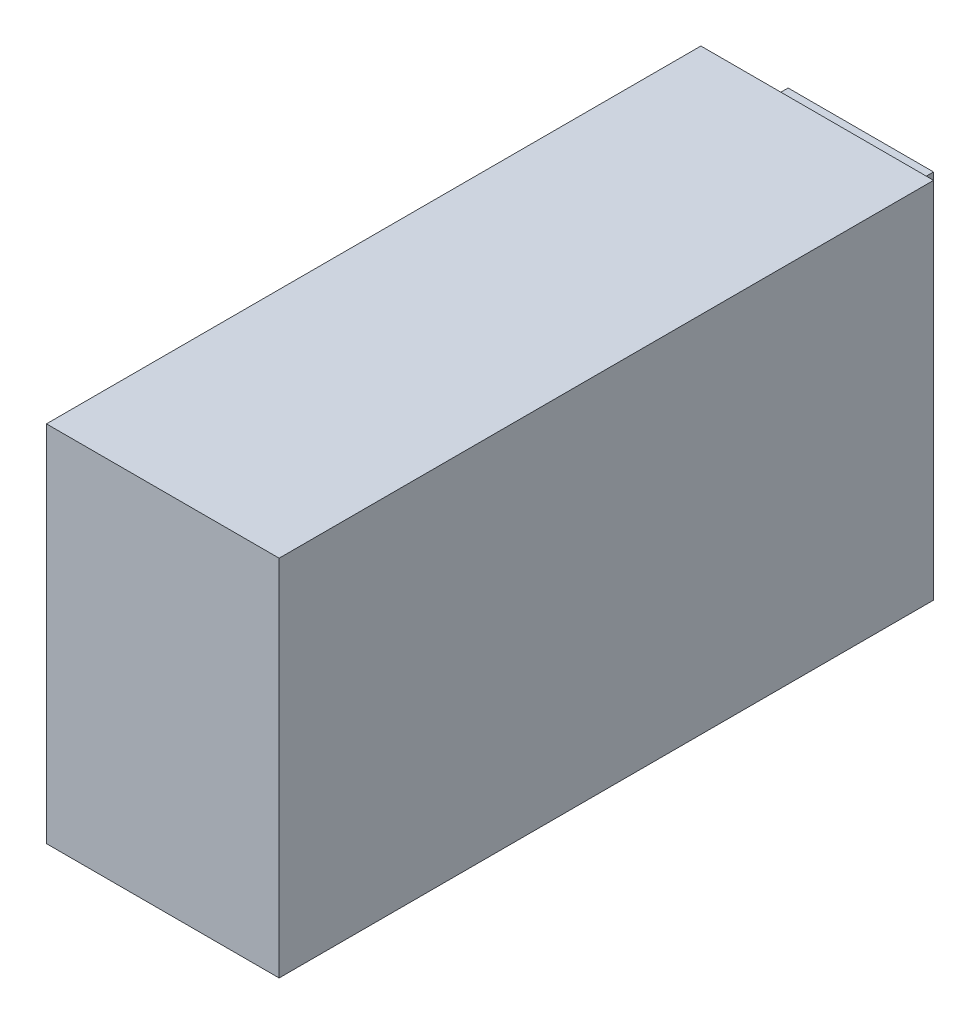
ISO-10303-21;
HEADER;
FILE_DESCRIPTION(('STEP AP214'),'2;1');
FILE_NAME('part.step','',(''),(''),'','','');
FILE_SCHEMA(('AUTOMOTIVE_DESIGN { 1 0 10303 214 1 1 1 1 }'));
ENDSEC;
DATA;
#1=APPLICATION_CONTEXT('core data for automotive mechanical design processes');
#2=APPLICATION_PROTOCOL_DEFINITION('international standard','automotive_design',2000,#1);
#3=PRODUCT_CONTEXT('',#1,'mechanical');
#4=PRODUCT('Part','Part','',(#3));
#5=PRODUCT_RELATED_PRODUCT_CATEGORY('part','',(#4));
#6=PRODUCT_DEFINITION_FORMATION('','',#4);
#7=PRODUCT_DEFINITION_CONTEXT('part definition',#1,'design');
#8=PRODUCT_DEFINITION('design','',#6,#7);
#9=PRODUCT_DEFINITION_SHAPE('','',#8);
#10=(LENGTH_UNIT() NAMED_UNIT(*) SI_UNIT(.MILLI.,.METRE.));
#11=(NAMED_UNIT(*) PLANE_ANGLE_UNIT() SI_UNIT($,.RADIAN.));
#12=(NAMED_UNIT(*) SI_UNIT($,.STERADIAN.) SOLID_ANGLE_UNIT());
#13=UNCERTAINTY_MEASURE_WITH_UNIT(LENGTH_MEASURE(1.E-05),#10,'distance_accuracy_value','');
#14=(GEOMETRIC_REPRESENTATION_CONTEXT(3) GLOBAL_UNCERTAINTY_ASSIGNED_CONTEXT((#13)) GLOBAL_UNIT_ASSIGNED_CONTEXT((#10,
#11,#12)) REPRESENTATION_CONTEXT('',''));
#15=CARTESIAN_POINT('',(0.,0.,0.));
#16=DIRECTION('',(0.,0.,1.));
#17=DIRECTION('',(1.,0.,0.));
#18=AXIS2_PLACEMENT_3D('',#15,#16,#17);
#19=CARTESIAN_POINT('',(0.,25.,-45.));
#20=DIRECTION('',(0.,0.,1.));
#21=DIRECTION('',(1.,0.,0.));
#22=AXIS2_PLACEMENT_3D('',#19,#20,#21);
#23=PLANE('',#22);
#24=DIRECTION('',(-1.,0.,0.));
#25=VECTOR('',#24,1.);
#26=CARTESIAN_POINT('',(0.,0.,-45.));
#27=LINE('',#26,#25);
#28=CARTESIAN_POINT('',(16.,0.,-45.));
#29=VERTEX_POINT('',#28);
#30=CARTESIAN_POINT('',(0.,0.,-45.));
#31=VERTEX_POINT('',#30);
#32=EDGE_CURVE('E131',#29,#31,#27,.T.);
#33=ORIENTED_EDGE('',*,*,#32,.T.);
#34=DIRECTION('',(0.,-1.,0.));
#35=VECTOR('',#34,1.);
#36=CARTESIAN_POINT('',(0.,25.,-45.));
#37=LINE('',#36,#35);
#38=CARTESIAN_POINT('',(0.,25.,-45.));
#39=VERTEX_POINT('',#38);
#40=EDGE_CURVE('E136',#39,#31,#37,.T.);
#41=ORIENTED_EDGE('',*,*,#40,.F.);
#42=DIRECTION('',(-1.,0.,0.));
#43=VECTOR('',#42,1.);
#44=CARTESIAN_POINT('',(0.,25.,-45.));
#45=LINE('',#44,#43);
#46=CARTESIAN_POINT('',(16.,25.,-45.));
#47=VERTEX_POINT('',#46);
#48=EDGE_CURVE('E135',#47,#39,#45,.T.);
#49=ORIENTED_EDGE('',*,*,#48,.F.);
#50=DIRECTION('',(0.,-1.,0.));
#51=VECTOR('',#50,1.);
#52=CARTESIAN_POINT('',(16.,25.,-45.));
#53=LINE('',#52,#51);
#54=EDGE_CURVE('E144',#47,#29,#53,.T.);
#55=ORIENTED_EDGE('',*,*,#54,.T.);
#56=EDGE_LOOP('',(#33,#41,#49,#55));
#57=FACE_BOUND('',#56,.T.);
#58=DIRECTION('',(0.,-1.,0.));
#59=VECTOR('',#58,1.);
#60=CARTESIAN_POINT('',(13.,22.5,-45.));
#61=LINE('',#60,#59);
#62=CARTESIAN_POINT('',(13.,22.5,-45.));
#63=VERTEX_POINT('',#62);
#64=CARTESIAN_POINT('',(13.,2.5,-45.));
#65=VERTEX_POINT('',#64);
#66=EDGE_CURVE('E48',#63,#65,#61,.T.);
#67=ORIENTED_EDGE('',*,*,#66,.F.);
#68=DIRECTION('',(1.,0.,0.));
#69=VECTOR('',#68,1.);
#70=CARTESIAN_POINT('',(13.,22.5,-45.));
#71=LINE('',#70,#69);
#72=CARTESIAN_POINT('',(3.,22.5,-45.));
#73=VERTEX_POINT('',#72);
#74=EDGE_CURVE('E52',#73,#63,#71,.T.);
#75=ORIENTED_EDGE('',*,*,#74,.F.);
#76=DIRECTION('',(0.,1.,0.));
#77=VECTOR('',#76,1.);
#78=CARTESIAN_POINT('',(3.,22.5,-45.));
#79=LINE('',#78,#77);
#80=CARTESIAN_POINT('',(3.,2.5,-45.));
#81=VERTEX_POINT('',#80);
#82=EDGE_CURVE('E260',#81,#73,#79,.T.);
#83=ORIENTED_EDGE('',*,*,#82,.F.);
#84=DIRECTION('',(-1.,0.,0.));
#85=VECTOR('',#84,1.);
#86=CARTESIAN_POINT('',(13.,2.5,-45.));
#87=LINE('',#86,#85);
#88=EDGE_CURVE('E266',#65,#81,#87,.T.);
#89=ORIENTED_EDGE('',*,*,#88,.F.);
#90=EDGE_LOOP('',(#67,#75,#83,#89));
#91=FACE_BOUND('',#90,.T.);
#92=ADVANCED_FACE('F33',(#57,#91),#23,.F.);
#93=CARTESIAN_POINT('',(0.,25.,0.));
#94=DIRECTION('',(1.,0.,0.));
#95=DIRECTION('',(0.,0.,-1.));
#96=AXIS2_PLACEMENT_3D('',#93,#94,#95);
#97=PLANE('',#96);
#98=DIRECTION('',(0.,0.,1.));
#99=VECTOR('',#98,1.);
#100=CARTESIAN_POINT('',(0.,0.,0.));
#101=LINE('',#100,#99);
#102=CARTESIAN_POINT('',(0.,0.,0.));
#103=VERTEX_POINT('',#102);
#104=EDGE_CURVE('E118',#31,#103,#101,.T.);
#105=ORIENTED_EDGE('',*,*,#104,.T.);
#106=DIRECTION('',(0.,-1.,0.));
#107=VECTOR('',#106,1.);
#108=CARTESIAN_POINT('',(0.,25.,0.));
#109=LINE('',#108,#107);
#110=CARTESIAN_POINT('',(0.,25.,0.));
#111=VERTEX_POINT('',#110);
#112=EDGE_CURVE('E11',#111,#103,#109,.T.);
#113=ORIENTED_EDGE('',*,*,#112,.F.);
#114=DIRECTION('',(0.,0.,1.));
#115=VECTOR('',#114,1.);
#116=CARTESIAN_POINT('',(0.,25.,0.));
#117=LINE('',#116,#115);
#118=EDGE_CURVE('E127',#39,#111,#117,.T.);
#119=ORIENTED_EDGE('',*,*,#118,.F.);
#120=ORIENTED_EDGE('',*,*,#40,.T.);
#121=EDGE_LOOP('',(#105,#113,#119,#120));
#122=FACE_BOUND('',#121,.T.);
#123=ADVANCED_FACE('F35',(#122),#97,.F.);
#124=CARTESIAN_POINT('',(0.,25.,0.));
#125=DIRECTION('',(0.,0.,-1.));
#126=DIRECTION('',(-1.,0.,0.));
#127=AXIS2_PLACEMENT_3D('',#124,#125,#126);
#128=PLANE('',#127);
#129=DIRECTION('',(1.,0.,0.));
#130=VECTOR('',#129,1.);
#131=CARTESIAN_POINT('',(0.,0.,0.));
#132=LINE('',#131,#130);
#133=CARTESIAN_POINT('',(16.,0.,0.));
#134=VERTEX_POINT('',#133);
#135=EDGE_CURVE('E121',#103,#134,#132,.T.);
#136=ORIENTED_EDGE('',*,*,#135,.T.);
#137=DIRECTION('',(0.,-1.,0.));
#138=VECTOR('',#137,1.);
#139=CARTESIAN_POINT('',(16.,25.,0.));
#140=LINE('',#139,#138);
#141=CARTESIAN_POINT('',(16.,25.,0.));
#142=VERTEX_POINT('',#141);
#143=EDGE_CURVE('E41',#142,#134,#140,.T.);
#144=ORIENTED_EDGE('',*,*,#143,.F.);
#145=DIRECTION('',(1.,0.,0.));
#146=VECTOR('',#145,1.);
#147=CARTESIAN_POINT('',(0.,25.,0.));
#148=LINE('',#147,#146);
#149=EDGE_CURVE('E130',#111,#142,#148,.T.);
#150=ORIENTED_EDGE('',*,*,#149,.F.);
#151=ORIENTED_EDGE('',*,*,#112,.T.);
#152=EDGE_LOOP('',(#136,#144,#150,#151));
#153=FACE_BOUND('',#152,.T.);
#154=ADVANCED_FACE('F166',(#153),#128,.F.);
#155=CARTESIAN_POINT('',(16.,25.,0.));
#156=DIRECTION('',(-1.,0.,0.));
#157=DIRECTION('',(0.,0.,1.));
#158=AXIS2_PLACEMENT_3D('',#155,#156,#157);
#159=PLANE('',#158);
#160=DIRECTION('',(0.,0.,-1.));
#161=VECTOR('',#160,1.);
#162=CARTESIAN_POINT('',(16.,0.,0.));
#163=LINE('',#162,#161);
#164=EDGE_CURVE('E139',#134,#29,#163,.T.);
#165=ORIENTED_EDGE('',*,*,#164,.T.);
#166=ORIENTED_EDGE('',*,*,#54,.F.);
#167=DIRECTION('',(0.,0.,-1.));
#168=VECTOR('',#167,1.);
#169=CARTESIAN_POINT('',(16.,25.,0.));
#170=LINE('',#169,#168);
#171=EDGE_CURVE('E133',#142,#47,#170,.T.);
#172=ORIENTED_EDGE('',*,*,#171,.F.);
#173=ORIENTED_EDGE('',*,*,#143,.T.);
#174=EDGE_LOOP('',(#165,#166,#172,#173));
#175=FACE_BOUND('',#174,.T.);
#176=ADVANCED_FACE('F151',(#175),#159,.F.);
#177=CARTESIAN_POINT('',(0.,25.,0.));
#178=DIRECTION('',(0.,-1.,0.));
#179=DIRECTION('',(0.,0.,-1.));
#180=AXIS2_PLACEMENT_3D('',#177,#178,#179);
#181=PLANE('',#180);
#182=ORIENTED_EDGE('',*,*,#118,.T.);
#183=ORIENTED_EDGE('',*,*,#149,.T.);
#184=ORIENTED_EDGE('',*,*,#171,.T.);
#185=ORIENTED_EDGE('',*,*,#48,.T.);
#186=EDGE_LOOP('',(#182,#183,#184,#185));
#187=FACE_BOUND('',#186,.T.);
#188=ADVANCED_FACE('F165',(#187),#181,.F.);
#189=CARTESIAN_POINT('',(0.,0.,0.));
#190=DIRECTION('',(0.,-1.,0.));
#191=DIRECTION('',(0.,0.,-1.));
#192=AXIS2_PLACEMENT_3D('',#189,#190,#191);
#193=PLANE('',#192);
#194=ORIENTED_EDGE('',*,*,#104,.F.);
#195=ORIENTED_EDGE('',*,*,#32,.F.);
#196=ORIENTED_EDGE('',*,*,#164,.F.);
#197=ORIENTED_EDGE('',*,*,#135,.F.);
#198=EDGE_LOOP('',(#194,#195,#196,#197));
#199=FACE_BOUND('',#198,.T.);
#200=ADVANCED_FACE('F157',(#199),#193,.T.);
#201=CARTESIAN_POINT('',(13.,22.5,-48.));
#202=DIRECTION('',(-1.,0.,0.));
#203=DIRECTION('',(0.,0.,1.));
#204=AXIS2_PLACEMENT_3D('',#201,#202,#203);
#205=PLANE('',#204);
#206=ORIENTED_EDGE('',*,*,#66,.T.);
#207=DIRECTION('',(0.,0.,1.));
#208=VECTOR('',#207,1.);
#209=CARTESIAN_POINT('',(13.,2.5,-48.));
#210=LINE('',#209,#208);
#211=CARTESIAN_POINT('',(13.,2.5,-48.));
#212=VERTEX_POINT('',#211);
#213=EDGE_CURVE('E101',#212,#65,#210,.T.);
#214=ORIENTED_EDGE('',*,*,#213,.F.);
#215=DIRECTION('',(0.,-1.,0.));
#216=VECTOR('',#215,1.);
#217=CARTESIAN_POINT('',(13.,22.5,-48.));
#218=LINE('',#217,#216);
#219=CARTESIAN_POINT('',(13.,22.5,-48.));
#220=VERTEX_POINT('',#219);
#221=EDGE_CURVE('E107',#220,#212,#218,.T.);
#222=ORIENTED_EDGE('',*,*,#221,.F.);
#223=DIRECTION('',(0.,0.,1.));
#224=VECTOR('',#223,1.);
#225=CARTESIAN_POINT('',(13.,22.5,-48.));
#226=LINE('',#225,#224);
#227=EDGE_CURVE('E258',#220,#63,#226,.T.);
#228=ORIENTED_EDGE('',*,*,#227,.T.);
#229=EDGE_LOOP('',(#206,#214,#222,#228));
#230=FACE_BOUND('',#229,.T.);
#231=ADVANCED_FACE('F117',(#230),#205,.F.);
#232=CARTESIAN_POINT('',(13.,2.5,-48.));
#233=DIRECTION('',(0.,1.,0.));
#234=DIRECTION('',(-1.,0.,0.));
#235=AXIS2_PLACEMENT_3D('',#232,#233,#234);
#236=PLANE('',#235);
#237=ORIENTED_EDGE('',*,*,#88,.T.);
#238=DIRECTION('',(0.,0.,1.));
#239=VECTOR('',#238,1.);
#240=CARTESIAN_POINT('',(3.,2.5,-48.));
#241=LINE('',#240,#239);
#242=CARTESIAN_POINT('',(3.,2.5,-48.));
#243=VERTEX_POINT('',#242);
#244=EDGE_CURVE('E103',#243,#81,#241,.T.);
#245=ORIENTED_EDGE('',*,*,#244,.F.);
#246=DIRECTION('',(-1.,0.,0.));
#247=VECTOR('',#246,1.);
#248=CARTESIAN_POINT('',(13.,2.5,-48.));
#249=LINE('',#248,#247);
#250=EDGE_CURVE('E96',#212,#243,#249,.T.);
#251=ORIENTED_EDGE('',*,*,#250,.F.);
#252=ORIENTED_EDGE('',*,*,#213,.T.);
#253=EDGE_LOOP('',(#237,#245,#251,#252));
#254=FACE_BOUND('',#253,.T.);
#255=ADVANCED_FACE('F99',(#254),#236,.F.);
#256=CARTESIAN_POINT('',(3.,22.5,-48.));
#257=DIRECTION('',(1.,0.,0.));
#258=DIRECTION('',(0.,1.,0.));
#259=AXIS2_PLACEMENT_3D('',#256,#257,#258);
#260=PLANE('',#259);
#261=ORIENTED_EDGE('',*,*,#82,.T.);
#262=DIRECTION('',(0.,0.,1.));
#263=VECTOR('',#262,1.);
#264=CARTESIAN_POINT('',(3.,22.5,-48.));
#265=LINE('',#264,#263);
#266=CARTESIAN_POINT('',(3.,22.5,-48.));
#267=VERTEX_POINT('',#266);
#268=EDGE_CURVE('E123',#267,#73,#265,.T.);
#269=ORIENTED_EDGE('',*,*,#268,.F.);
#270=DIRECTION('',(0.,1.,0.));
#271=VECTOR('',#270,1.);
#272=CARTESIAN_POINT('',(3.,22.5,-48.));
#273=LINE('',#272,#271);
#274=EDGE_CURVE('E106',#243,#267,#273,.T.);
#275=ORIENTED_EDGE('',*,*,#274,.F.);
#276=ORIENTED_EDGE('',*,*,#244,.T.);
#277=EDGE_LOOP('',(#261,#269,#275,#276));
#278=FACE_BOUND('',#277,.T.);
#279=ADVANCED_FACE('F186',(#278),#260,.F.);
#280=CARTESIAN_POINT('',(13.,22.5,-48.));
#281=DIRECTION('',(0.,-1.,0.));
#282=DIRECTION('',(0.,0.,-1.));
#283=AXIS2_PLACEMENT_3D('',#280,#281,#282);
#284=PLANE('',#283);
#285=ORIENTED_EDGE('',*,*,#74,.T.);
#286=ORIENTED_EDGE('',*,*,#227,.F.);
#287=DIRECTION('',(1.,0.,0.));
#288=VECTOR('',#287,1.);
#289=CARTESIAN_POINT('',(13.,22.5,-48.));
#290=LINE('',#289,#288);
#291=EDGE_CURVE('E112',#267,#220,#290,.T.);
#292=ORIENTED_EDGE('',*,*,#291,.F.);
#293=ORIENTED_EDGE('',*,*,#268,.T.);
#294=EDGE_LOOP('',(#285,#286,#292,#293));
#295=FACE_BOUND('',#294,.T.);
#296=ADVANCED_FACE('F189',(#295),#284,.F.);
#297=CARTESIAN_POINT('',(0.,0.,-48.));
#298=DIRECTION('',(0.,0.,-1.));
#299=DIRECTION('',(-1.,0.,0.));
#300=AXIS2_PLACEMENT_3D('',#297,#298,#299);
#301=PLANE('',#300);
#302=ORIENTED_EDGE('',*,*,#221,.T.);
#303=ORIENTED_EDGE('',*,*,#250,.T.);
#304=ORIENTED_EDGE('',*,*,#274,.T.);
#305=ORIENTED_EDGE('',*,*,#291,.T.);
#306=EDGE_LOOP('',(#302,#303,#304,#305));
#307=FACE_BOUND('',#306,.T.);
#308=ADVANCED_FACE('F110',(#307),#301,.T.);
#309=CLOSED_SHELL('',(#92,#123,#154,#176,#188,#200,#231,#255,#279,#296,#308));
#310=MANIFOLD_SOLID_BREP('B2',#309);
#311=ADVANCED_BREP_SHAPE_REPRESENTATION('',(#18,#310),#14);
#312=SHAPE_DEFINITION_REPRESENTATION(#9,#311);
ENDSEC;
END-ISO-10303-21;
